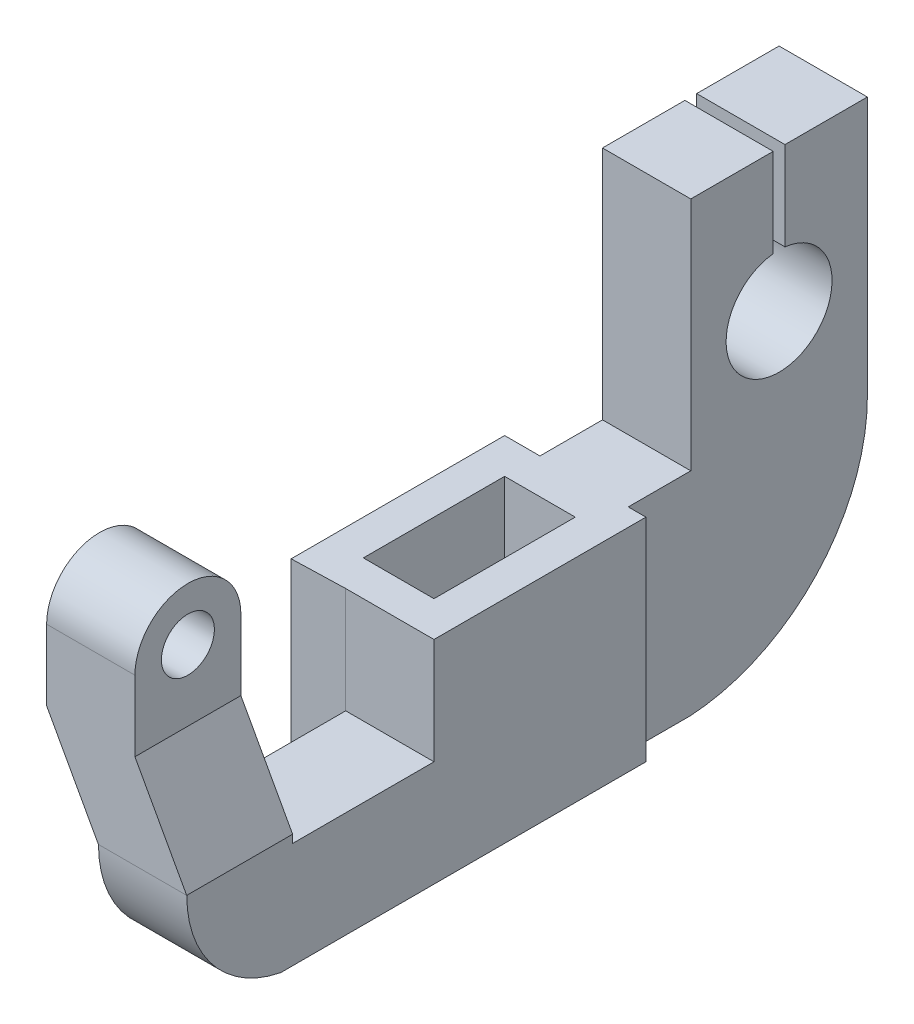
ISO-10303-21;
HEADER;
FILE_DESCRIPTION(('STEP AP214'),'2;1');
FILE_NAME('part.step','',(''),(''),'','','');
FILE_SCHEMA(('AUTOMOTIVE_DESIGN { 1 0 10303 214 1 1 1 1 }'));
ENDSEC;
DATA;
#1=APPLICATION_CONTEXT('core data for automotive mechanical design processes');
#2=APPLICATION_PROTOCOL_DEFINITION('international standard','automotive_design',2000,#1);
#3=PRODUCT_CONTEXT('',#1,'mechanical');
#4=PRODUCT('Part','Part','',(#3));
#5=PRODUCT_RELATED_PRODUCT_CATEGORY('part','',(#4));
#6=PRODUCT_DEFINITION_FORMATION('','',#4);
#7=PRODUCT_DEFINITION_CONTEXT('part definition',#1,'design');
#8=PRODUCT_DEFINITION('design','',#6,#7);
#9=PRODUCT_DEFINITION_SHAPE('','',#8);
#10=(LENGTH_UNIT() NAMED_UNIT(*) SI_UNIT(.MILLI.,.METRE.));
#11=(NAMED_UNIT(*) PLANE_ANGLE_UNIT() SI_UNIT($,.RADIAN.));
#12=(NAMED_UNIT(*) SI_UNIT($,.STERADIAN.) SOLID_ANGLE_UNIT());
#13=UNCERTAINTY_MEASURE_WITH_UNIT(LENGTH_MEASURE(1.E-05),#10,'distance_accuracy_value','');
#14=(GEOMETRIC_REPRESENTATION_CONTEXT(3) GLOBAL_UNCERTAINTY_ASSIGNED_CONTEXT((#13)) GLOBAL_UNIT_ASSIGNED_CONTEXT((#10,
#11,#12)) REPRESENTATION_CONTEXT('',''));
#15=CARTESIAN_POINT('',(0.,0.,0.));
#16=DIRECTION('',(0.,0.,1.));
#17=DIRECTION('',(1.,0.,0.));
#18=AXIS2_PLACEMENT_3D('',#15,#16,#17);
#19=CARTESIAN_POINT('',(-15.,0.,-36.2652508818495));
#20=DIRECTION('',(0.,0.,-1.));
#21=DIRECTION('',(-1.,0.,0.));
#22=AXIS2_PLACEMENT_3D('',#19,#20,#21);
#23=PLANE('',#22);
#24=DIRECTION('',(1.,0.,0.));
#25=VECTOR('',#24,1.);
#26=CARTESIAN_POINT('',(-15.,0.,-36.2652508818495));
#27=LINE('',#26,#25);
#28=CARTESIAN_POINT('',(-3.,0.,-36.2652508818495));
#29=VERTEX_POINT('',#28);
#30=CARTESIAN_POINT('',(0.,0.,-36.2652508818495));
#31=VERTEX_POINT('',#30);
#32=EDGE_CURVE('E490',#29,#31,#27,.T.);
#33=ORIENTED_EDGE('',*,*,#32,.F.);
#34=DIRECTION('',(0.,1.,0.));
#35=VECTOR('',#34,1.);
#36=CARTESIAN_POINT('',(-3.,0.,-36.2652508818495));
#37=LINE('',#36,#35);
#38=CARTESIAN_POINT('',(-3.,36.,-36.2652508818495));
#39=VERTEX_POINT('',#38);
#40=EDGE_CURVE('E358',#29,#39,#37,.T.);
#41=ORIENTED_EDGE('',*,*,#40,.T.);
#42=DIRECTION('',(1.,0.,0.));
#43=VECTOR('',#42,1.);
#44=CARTESIAN_POINT('',(-15.,36.,-36.2652508818495));
#45=LINE('',#44,#43);
#46=CARTESIAN_POINT('',(0.,36.,-36.2652508818495));
#47=VERTEX_POINT('',#46);
#48=EDGE_CURVE('E489',#39,#47,#45,.T.);
#49=ORIENTED_EDGE('',*,*,#48,.T.);
#50=DIRECTION('',(0.,1.,0.));
#51=VECTOR('',#50,1.);
#52=CARTESIAN_POINT('',(0.,0.,-36.2652508818495));
#53=LINE('',#52,#51);
#54=EDGE_CURVE('E464',#31,#47,#53,.T.);
#55=ORIENTED_EDGE('',*,*,#54,.F.);
#56=EDGE_LOOP('',(#33,#41,#49,#55));
#57=FACE_BOUND('',#56,.T.);
#58=ADVANCED_FACE('F43',(#57),#23,.T.);
#59=CARTESIAN_POINT('',(-15.,19.3567810669885,23.7347491181505));
#60=DIRECTION('',(0.,1.,0.));
#61=DIRECTION('',(0.,0.,1.));
#62=AXIS2_PLACEMENT_3D('',#59,#60,#61);
#63=PLANE('',#62);
#64=DIRECTION('',(0.,0.,1.));
#65=VECTOR('',#64,1.);
#66=CARTESIAN_POINT('',(-15.,19.3567810669885,23.7347491181505));
#67=LINE('',#66,#65);
#68=CARTESIAN_POINT('',(-15.,19.3567810669885,23.7347491181505));
#69=VERTEX_POINT('',#68);
#70=CARTESIAN_POINT('',(-15.,19.3567810669885,23.75));
#71=VERTEX_POINT('',#70);
#72=EDGE_CURVE('E456',#69,#71,#67,.T.);
#73=ORIENTED_EDGE('',*,*,#72,.T.);
#74=DIRECTION('',(1.,0.,0.));
#75=VECTOR('',#74,1.);
#76=CARTESIAN_POINT('',(-15.,19.3567810669885,23.75));
#77=LINE('',#76,#75);
#78=CARTESIAN_POINT('',(0.,19.3567810669885,23.75));
#79=VERTEX_POINT('',#78);
#80=EDGE_CURVE('E399',#71,#79,#77,.T.);
#81=ORIENTED_EDGE('',*,*,#80,.T.);
#82=DIRECTION('',(0.,0.,1.));
#83=VECTOR('',#82,1.);
#84=CARTESIAN_POINT('',(0.,19.3567810669885,23.7347491181505));
#85=LINE('',#84,#83);
#86=CARTESIAN_POINT('',(0.,19.3567810669885,23.7347491181505));
#87=VERTEX_POINT('',#86);
#88=EDGE_CURVE('E445',#87,#79,#85,.T.);
#89=ORIENTED_EDGE('',*,*,#88,.F.);
#90=DIRECTION('',(1.,0.,0.));
#91=VECTOR('',#90,1.);
#92=CARTESIAN_POINT('',(-15.,19.3567810669885,23.7347491181505));
#93=LINE('',#92,#91);
#94=EDGE_CURVE('E52',#69,#87,#93,.T.);
#95=ORIENTED_EDGE('',*,*,#94,.F.);
#96=EDGE_LOOP('',(#73,#81,#89,#95));
#97=FACE_BOUND('',#96,.T.);
#98=ADVANCED_FACE('F518',(#97),#63,.T.);
#99=CARTESIAN_POINT('',(-15.,19.3567810669885,22.0184091547458));
#100=DIRECTION('',(1.,0.,0.));
#101=DIRECTION('',(0.,0.,-1.));
#102=AXIS2_PLACEMENT_3D('',#99,#100,#101);
#103=CYLINDRICAL_SURFACE('',#102,19.7163399634047);
#104=CARTESIAN_POINT('',(0.,19.3567810669885,22.0184091547458));
#105=DIRECTION('',(1.,0.,0.));
#106=DIRECTION('',(0.,0.,-1.));
#107=AXIS2_PLACEMENT_3D('',#104,#105,#106);
#108=CIRCLE('',#107,19.7163399634047);
#109=CARTESIAN_POINT('',(0.,19.3567810669885,41.7347491181505));
#110=VERTEX_POINT('',#109);
#111=CARTESIAN_POINT('',(0.,0.,25.7666204984701));
#112=VERTEX_POINT('',#111);
#113=EDGE_CURVE('E440',#110,#112,#108,.T.);
#114=ORIENTED_EDGE('',*,*,#113,.F.);
#115=DIRECTION('',(1.,0.,0.));
#116=VECTOR('',#115,1.);
#117=CARTESIAN_POINT('',(-15.,19.3567810669885,41.7347491181505));
#118=LINE('',#117,#116);
#119=CARTESIAN_POINT('',(-15.,19.3567810669885,41.7347491181505));
#120=VERTEX_POINT('',#119);
#121=EDGE_CURVE('E11',#120,#110,#118,.T.);
#122=ORIENTED_EDGE('',*,*,#121,.F.);
#123=CARTESIAN_POINT('',(-15.,19.3567810669885,22.0184091547458));
#124=DIRECTION('',(1.,0.,0.));
#125=DIRECTION('',(0.,0.,-1.));
#126=AXIS2_PLACEMENT_3D('',#123,#124,#125);
#127=CIRCLE('',#126,19.7163399634047);
#128=CARTESIAN_POINT('',(-15.,0.,25.7666204984701));
#129=VERTEX_POINT('',#128);
#130=EDGE_CURVE('E441',#120,#129,#127,.T.);
#131=ORIENTED_EDGE('',*,*,#130,.T.);
#132=DIRECTION('',(1.,0.,0.));
#133=VECTOR('',#132,1.);
#134=CARTESIAN_POINT('',(-15.,0.,25.7666204984701));
#135=LINE('',#134,#133);
#136=EDGE_CURVE('E47',#129,#112,#135,.T.);
#137=ORIENTED_EDGE('',*,*,#136,.T.);
#138=EDGE_LOOP('',(#114,#122,#131,#137));
#139=FACE_BOUND('',#138,.T.);
#140=ADVANCED_FACE('F45',(#139),#103,.T.);
#141=CARTESIAN_POINT('',(-15.,18.,23.7347491181505));
#142=DIRECTION('',(0.,0.,-1.));
#143=DIRECTION('',(-1.,0.,0.));
#144=AXIS2_PLACEMENT_3D('',#141,#142,#143);
#145=PLANE('',#144);
#146=DIRECTION('',(0.,1.,0.));
#147=VECTOR('',#146,1.);
#148=CARTESIAN_POINT('',(0.,18.,23.7347491181505));
#149=LINE('',#148,#147);
#150=CARTESIAN_POINT('',(0.,18.,23.7347491181505));
#151=VERTEX_POINT('',#150);
#152=EDGE_CURVE('E476',#151,#87,#149,.T.);
#153=ORIENTED_EDGE('',*,*,#152,.F.);
#154=DIRECTION('',(1.,0.,0.));
#155=VECTOR('',#154,1.);
#156=CARTESIAN_POINT('',(-15.,18.,23.7347491181505));
#157=LINE('',#156,#155);
#158=CARTESIAN_POINT('',(-15.,18.,23.7347491181505));
#159=VERTEX_POINT('',#158);
#160=EDGE_CURVE('E483',#159,#151,#157,.T.);
#161=ORIENTED_EDGE('',*,*,#160,.F.);
#162=DIRECTION('',(0.,1.,0.));
#163=VECTOR('',#162,1.);
#164=CARTESIAN_POINT('',(-15.,18.,23.7347491181505));
#165=LINE('',#164,#163);
#166=EDGE_CURVE('E453',#159,#69,#165,.T.);
#167=ORIENTED_EDGE('',*,*,#166,.T.);
#168=ORIENTED_EDGE('',*,*,#94,.T.);
#169=EDGE_LOOP('',(#153,#161,#167,#168));
#170=FACE_BOUND('',#169,.T.);
#171=ADVANCED_FACE('F930',(#170),#145,.T.);
#172=CARTESIAN_POINT('',(-15.,18.,-0.265250881849475));
#173=DIRECTION('',(0.,1.,0.));
#174=DIRECTION('',(0.,0.,1.));
#175=AXIS2_PLACEMENT_3D('',#172,#173,#174);
#176=PLANE('',#175);
#177=DIRECTION('',(0.,0.,1.));
#178=VECTOR('',#177,1.);
#179=CARTESIAN_POINT('',(0.,18.,-0.265250881849475));
#180=LINE('',#179,#178);
#181=CARTESIAN_POINT('',(0.,18.,-0.265250881849475));
#182=VERTEX_POINT('',#181);
#183=EDGE_CURVE('E473',#182,#151,#180,.T.);
#184=ORIENTED_EDGE('',*,*,#183,.F.);
#185=DIRECTION('',(1.,0.,0.));
#186=VECTOR('',#185,1.);
#187=CARTESIAN_POINT('',(-15.,18.,-0.265250881849475));
#188=LINE('',#187,#186);
#189=CARTESIAN_POINT('',(-15.,18.,-0.265250881849475));
#190=VERTEX_POINT('',#189);
#191=EDGE_CURVE('E485',#190,#182,#188,.T.);
#192=ORIENTED_EDGE('',*,*,#191,.F.);
#193=DIRECTION('',(0.,0.,1.));
#194=VECTOR('',#193,1.);
#195=CARTESIAN_POINT('',(-15.,18.,-0.265250881849475));
#196=LINE('',#195,#194);
#197=EDGE_CURVE('E450',#190,#159,#196,.T.);
#198=ORIENTED_EDGE('',*,*,#197,.T.);
#199=ORIENTED_EDGE('',*,*,#160,.T.);
#200=EDGE_LOOP('',(#184,#192,#198,#199));
#201=FACE_BOUND('',#200,.T.);
#202=ADVANCED_FACE('F943',(#201),#176,.T.);
#203=CARTESIAN_POINT('',(-15.,36.,-0.26525088184947));
#204=DIRECTION('',(0.,0.,1.));
#205=DIRECTION('',(0.,-1.,0.));
#206=AXIS2_PLACEMENT_3D('',#203,#204,#205);
#207=PLANE('',#206);
#208=DIRECTION('',(0.,-1.,0.));
#209=VECTOR('',#208,1.);
#210=CARTESIAN_POINT('',(0.,36.,-0.26525088184947));
#211=LINE('',#210,#209);
#212=CARTESIAN_POINT('',(0.,36.,-0.26525088184947));
#213=VERTEX_POINT('',#212);
#214=EDGE_CURVE('E470',#213,#182,#211,.T.);
#215=ORIENTED_EDGE('',*,*,#214,.F.);
#216=DIRECTION('',(1.,0.,0.));
#217=VECTOR('',#216,1.);
#218=CARTESIAN_POINT('',(-15.,36.,-0.26525088184947));
#219=LINE('',#218,#217);
#220=CARTESIAN_POINT('',(-15.,36.,-0.26525088184947));
#221=VERTEX_POINT('',#220);
#222=EDGE_CURVE('E487',#221,#213,#219,.T.);
#223=ORIENTED_EDGE('',*,*,#222,.F.);
#224=DIRECTION('',(0.,-1.,0.));
#225=VECTOR('',#224,1.);
#226=CARTESIAN_POINT('',(-15.,36.,-0.26525088184947));
#227=LINE('',#226,#225);
#228=EDGE_CURVE('E447',#221,#190,#227,.T.);
#229=ORIENTED_EDGE('',*,*,#228,.T.);
#230=ORIENTED_EDGE('',*,*,#191,.T.);
#231=EDGE_LOOP('',(#215,#223,#229,#230));
#232=FACE_BOUND('',#231,.T.);
#233=ADVANCED_FACE('F568',(#232),#207,.T.);
#234=CARTESIAN_POINT('',(-15.,36.,-36.2652508818495));
#235=DIRECTION('',(0.,1.,0.));
#236=DIRECTION('',(0.,0.,1.));
#237=AXIS2_PLACEMENT_3D('',#234,#235,#236);
#238=PLANE('',#237);
#239=DIRECTION('',(0.,0.,1.));
#240=VECTOR('',#239,1.);
#241=CARTESIAN_POINT('',(-18.,36.,-30.2652508818495));
#242=LINE('',#241,#240);
#243=CARTESIAN_POINT('',(-18.,36.,-30.2652508818495));
#244=VERTEX_POINT('',#243);
#245=CARTESIAN_POINT('',(-18.,36.,-6.26525088184947));
#246=VERTEX_POINT('',#245);
#247=EDGE_CURVE('E302',#244,#246,#242,.T.);
#248=ORIENTED_EDGE('',*,*,#247,.F.);
#249=DIRECTION('',(-1.,0.,0.));
#250=VECTOR('',#249,1.);
#251=CARTESIAN_POINT('',(-18.,36.,-30.2652508818495));
#252=LINE('',#251,#250);
#253=CARTESIAN_POINT('',(-6.,36.,-30.2652508818495));
#254=VERTEX_POINT('',#253);
#255=EDGE_CURVE('E374',#254,#244,#252,.T.);
#256=ORIENTED_EDGE('',*,*,#255,.F.);
#257=DIRECTION('',(0.,0.,-1.));
#258=VECTOR('',#257,1.);
#259=CARTESIAN_POINT('',(-6.,36.,-30.2652508818495));
#260=LINE('',#259,#258);
#261=CARTESIAN_POINT('',(-6.,36.,-6.26525088184947));
#262=VERTEX_POINT('',#261);
#263=EDGE_CURVE('E381',#262,#254,#260,.T.);
#264=ORIENTED_EDGE('',*,*,#263,.F.);
#265=DIRECTION('',(1.,0.,0.));
#266=VECTOR('',#265,1.);
#267=CARTESIAN_POINT('',(-18.,36.,-6.26525088184947));
#268=LINE('',#267,#266);
#269=EDGE_CURVE('E368',#246,#262,#268,.T.);
#270=ORIENTED_EDGE('',*,*,#269,.F.);
#271=EDGE_LOOP('',(#248,#256,#264,#270));
#272=FACE_BOUND('',#271,.T.);
#273=DIRECTION('',(0.999565973902444,0.,-0.0294595284493729));
#274=VECTOR('',#273,1.);
#275=CARTESIAN_POINT('',(-24.,36.,0.));
#276=LINE('',#275,#274);
#277=CARTESIAN_POINT('',(-24.,36.,0.));
#278=VERTEX_POINT('',#277);
#279=EDGE_CURVE('E330',#278,#221,#276,.T.);
#280=ORIENTED_EDGE('',*,*,#279,.T.);
#281=ORIENTED_EDGE('',*,*,#222,.T.);
#282=DIRECTION('',(0.,0.,1.));
#283=VECTOR('',#282,1.);
#284=CARTESIAN_POINT('',(0.,36.,-36.2652508818495));
#285=LINE('',#284,#283);
#286=EDGE_CURVE('E467',#47,#213,#285,.T.);
#287=ORIENTED_EDGE('',*,*,#286,.F.);
#288=ORIENTED_EDGE('',*,*,#48,.F.);
#289=DIRECTION('',(0.,0.,-1.));
#290=VECTOR('',#289,1.);
#291=CARTESIAN_POINT('',(-3.,36.,-46.8885797178994));
#292=LINE('',#291,#290);
#293=CARTESIAN_POINT('',(-3.,36.,-46.8885797178994));
#294=VERTEX_POINT('',#293);
#295=EDGE_CURVE('E68',#39,#294,#292,.T.);
#296=ORIENTED_EDGE('',*,*,#295,.T.);
#297=DIRECTION('',(-1.,0.,0.));
#298=VECTOR('',#297,1.);
#299=CARTESIAN_POINT('',(-18.,36.,-46.8885797178994));
#300=LINE('',#299,#298);
#301=CARTESIAN_POINT('',(-18.,36.,-46.8885797178994));
#302=VERTEX_POINT('',#301);
#303=EDGE_CURVE('E360',#294,#302,#300,.T.);
#304=ORIENTED_EDGE('',*,*,#303,.T.);
#305=DIRECTION('',(0.,0.,1.));
#306=VECTOR('',#305,1.);
#307=CARTESIAN_POINT('',(-18.,36.,-36.2652508818495));
#308=LINE('',#307,#306);
#309=CARTESIAN_POINT('',(-18.,36.,-36.2652508818495));
#310=VERTEX_POINT('',#309);
#311=EDGE_CURVE('E352',#302,#310,#308,.T.);
#312=ORIENTED_EDGE('',*,*,#311,.T.);
#313=DIRECTION('',(-1.,0.,0.));
#314=VECTOR('',#313,1.);
#315=CARTESIAN_POINT('',(-15.,36.,-36.2652508818495));
#316=LINE('',#315,#314);
#317=CARTESIAN_POINT('',(-24.,36.,-36.2652508818495));
#318=VERTEX_POINT('',#317);
#319=EDGE_CURVE('E324',#310,#318,#316,.T.);
#320=ORIENTED_EDGE('',*,*,#319,.T.);
#321=DIRECTION('',(0.,0.,1.));
#322=VECTOR('',#321,1.);
#323=CARTESIAN_POINT('',(-24.,36.,-36.2652508818495));
#324=LINE('',#323,#322);
#325=EDGE_CURVE('E338',#318,#278,#324,.T.);
#326=ORIENTED_EDGE('',*,*,#325,.T.);
#327=EDGE_LOOP('',(#280,#281,#287,#288,#296,#304,#312,#320,#326));
#328=FACE_BOUND('',#327,.T.);
#329=ADVANCED_FACE('F559',(#272,#328),#238,.T.);
#330=CARTESIAN_POINT('',(-15.,0.,25.7666204984701));
#331=DIRECTION('',(0.,-1.,0.));
#332=DIRECTION('',(0.,0.,-1.));
#333=AXIS2_PLACEMENT_3D('',#330,#331,#332);
#334=PLANE('',#333);
#335=DIRECTION('',(0.,0.,1.));
#336=VECTOR('',#335,1.);
#337=CARTESIAN_POINT('',(-18.,0.,-30.2652508818495));
#338=LINE('',#337,#336);
#339=CARTESIAN_POINT('',(-18.,0.,-30.2652508818495));
#340=VERTEX_POINT('',#339);
#341=CARTESIAN_POINT('',(-18.,0.,-6.26525088184948));
#342=VERTEX_POINT('',#341);
#343=EDGE_CURVE('E315',#340,#342,#338,.T.);
#344=ORIENTED_EDGE('',*,*,#343,.T.);
#345=DIRECTION('',(1.,0.,0.));
#346=VECTOR('',#345,1.);
#347=CARTESIAN_POINT('',(-18.,0.,-6.26525088184948));
#348=LINE('',#347,#346);
#349=CARTESIAN_POINT('',(-6.,0.,-6.26525088184948));
#350=VERTEX_POINT('',#349);
#351=EDGE_CURVE('E370',#342,#350,#348,.T.);
#352=ORIENTED_EDGE('',*,*,#351,.T.);
#353=DIRECTION('',(0.,0.,-1.));
#354=VECTOR('',#353,1.);
#355=CARTESIAN_POINT('',(-6.,0.,-30.2652508818495));
#356=LINE('',#355,#354);
#357=CARTESIAN_POINT('',(-6.,0.,-30.2652508818495));
#358=VERTEX_POINT('',#357);
#359=EDGE_CURVE('E373',#350,#358,#356,.T.);
#360=ORIENTED_EDGE('',*,*,#359,.T.);
#361=DIRECTION('',(-1.,0.,0.));
#362=VECTOR('',#361,1.);
#363=CARTESIAN_POINT('',(-18.,0.,-30.2652508818495));
#364=LINE('',#363,#362);
#365=EDGE_CURVE('E377',#358,#340,#364,.T.);
#366=ORIENTED_EDGE('',*,*,#365,.T.);
#367=EDGE_LOOP('',(#344,#352,#360,#366));
#368=FACE_BOUND('',#367,.T.);
#369=DIRECTION('',(0.,0.,-1.));
#370=VECTOR('',#369,1.);
#371=CARTESIAN_POINT('',(-15.,0.,25.7666204984701));
#372=LINE('',#371,#370);
#373=CARTESIAN_POINT('',(-15.,0.,-0.26525088184947));
#374=VERTEX_POINT('',#373);
#375=EDGE_CURVE('E444',#129,#374,#372,.T.);
#376=ORIENTED_EDGE('',*,*,#375,.T.);
#377=DIRECTION('',(0.999565973902444,0.,-0.0294595284493729));
#378=VECTOR('',#377,1.);
#379=CARTESIAN_POINT('',(-24.,0.,0.));
#380=LINE('',#379,#378);
#381=CARTESIAN_POINT('',(-24.,0.,0.));
#382=VERTEX_POINT('',#381);
#383=EDGE_CURVE('E333',#382,#374,#380,.T.);
#384=ORIENTED_EDGE('',*,*,#383,.F.);
#385=DIRECTION('',(0.,0.,1.));
#386=VECTOR('',#385,1.);
#387=CARTESIAN_POINT('',(-24.,0.,-36.2652508818495));
#388=LINE('',#387,#386);
#389=CARTESIAN_POINT('',(-24.,0.,-36.2652508818495));
#390=VERTEX_POINT('',#389);
#391=EDGE_CURVE('E329',#390,#382,#388,.T.);
#392=ORIENTED_EDGE('',*,*,#391,.F.);
#393=DIRECTION('',(-1.,0.,0.));
#394=VECTOR('',#393,1.);
#395=CARTESIAN_POINT('',(-15.,0.,-36.2652508818495));
#396=LINE('',#395,#394);
#397=CARTESIAN_POINT('',(-18.,0.,-36.2652508818495));
#398=VERTEX_POINT('',#397);
#399=EDGE_CURVE('E327',#398,#390,#396,.T.);
#400=ORIENTED_EDGE('',*,*,#399,.F.);
#401=DIRECTION('',(0.,0.,1.));
#402=VECTOR('',#401,1.);
#403=CARTESIAN_POINT('',(-18.,0.,-36.2652508818495));
#404=LINE('',#403,#402);
#405=CARTESIAN_POINT('',(-18.,0.,-46.8885797178995));
#406=VERTEX_POINT('',#405);
#407=EDGE_CURVE('E355',#406,#398,#404,.T.);
#408=ORIENTED_EDGE('',*,*,#407,.F.);
#409=DIRECTION('',(-1.,0.,0.));
#410=VECTOR('',#409,1.);
#411=CARTESIAN_POINT('',(-18.,0.,-46.8885797178995));
#412=LINE('',#411,#410);
#413=CARTESIAN_POINT('',(-3.,0.,-46.8885797178995));
#414=VERTEX_POINT('',#413);
#415=EDGE_CURVE('E351',#414,#406,#412,.T.);
#416=ORIENTED_EDGE('',*,*,#415,.F.);
#417=DIRECTION('',(0.,0.,-1.));
#418=VECTOR('',#417,1.);
#419=CARTESIAN_POINT('',(-3.,0.,-46.8885797178995));
#420=LINE('',#419,#418);
#421=EDGE_CURVE('E348',#29,#414,#420,.T.);
#422=ORIENTED_EDGE('',*,*,#421,.F.);
#423=ORIENTED_EDGE('',*,*,#32,.T.);
#424=DIRECTION('',(0.,0.,-1.));
#425=VECTOR('',#424,1.);
#426=CARTESIAN_POINT('',(0.,0.,25.7666204984701));
#427=LINE('',#426,#425);
#428=EDGE_CURVE('E461',#112,#31,#427,.T.);
#429=ORIENTED_EDGE('',*,*,#428,.F.);
#430=ORIENTED_EDGE('',*,*,#136,.F.);
#431=EDGE_LOOP('',(#376,#384,#392,#400,#408,#416,#422,#423,#429,#430));
#432=FACE_BOUND('',#431,.T.);
#433=ADVANCED_FACE('F500',(#368,#432),#334,.T.);
#434=CARTESIAN_POINT('',(-15.,19.3567810669885,22.0184091547458));
#435=DIRECTION('',(1.,0.,0.));
#436=DIRECTION('',(0.,0.,-1.));
#437=AXIS2_PLACEMENT_3D('',#434,#435,#436);
#438=PLANE('',#437);
#439=ORIENTED_EDGE('',*,*,#197,.F.);
#440=DIRECTION('',(0.,1.,0.));
#441=VECTOR('',#440,1.);
#442=CARTESIAN_POINT('',(-15.,0.,-0.265250881849478));
#443=LINE('',#442,#441);
#444=EDGE_CURVE('E60',#374,#190,#443,.T.);
#445=ORIENTED_EDGE('',*,*,#444,.F.);
#446=ORIENTED_EDGE('',*,*,#375,.F.);
#447=ORIENTED_EDGE('',*,*,#130,.F.);
#448=DIRECTION('',(0.,0.,-1.));
#449=VECTOR('',#448,1.);
#450=CARTESIAN_POINT('',(-15.,19.3567810669885,41.75));
#451=LINE('',#450,#449);
#452=EDGE_CURVE('E416',#120,#71,#451,.T.);
#453=ORIENTED_EDGE('',*,*,#452,.T.);
#454=ORIENTED_EDGE('',*,*,#72,.F.);
#455=ORIENTED_EDGE('',*,*,#166,.F.);
#456=EDGE_LOOP('',(#439,#445,#446,#447,#453,#454,#455));
#457=FACE_BOUND('',#456,.T.);
#458=ADVANCED_FACE('F521',(#457),#438,.F.);
#459=CARTESIAN_POINT('',(0.,19.3567810669885,22.0184091547458));
#460=DIRECTION('',(1.,0.,0.));
#461=DIRECTION('',(0.,0.,-1.));
#462=AXIS2_PLACEMENT_3D('',#459,#460,#461);
#463=PLANE('',#462);
#464=ORIENTED_EDGE('',*,*,#113,.T.);
#465=ORIENTED_EDGE('',*,*,#428,.T.);
#466=ORIENTED_EDGE('',*,*,#54,.T.);
#467=ORIENTED_EDGE('',*,*,#286,.T.);
#468=ORIENTED_EDGE('',*,*,#214,.T.);
#469=ORIENTED_EDGE('',*,*,#183,.T.);
#470=ORIENTED_EDGE('',*,*,#152,.T.);
#471=ORIENTED_EDGE('',*,*,#88,.T.);
#472=EDGE_CURVE('E479',#79,#110,#85,.T.);
#473=ORIENTED_EDGE('',*,*,#472,.T.);
#474=EDGE_LOOP('',(#464,#465,#466,#467,#468,#469,#470,#471,#473));
#475=FACE_BOUND('',#474,.T.);
#476=ADVANCED_FACE('F503',(#475),#463,.T.);
#477=CARTESIAN_POINT('',(-15.,19.3567810669885,41.75));
#478=DIRECTION('',(0.,1.,0.));
#479=DIRECTION('',(0.,0.,1.));
#480=AXIS2_PLACEMENT_3D('',#477,#478,#479);
#481=PLANE('',#480);
#482=ORIENTED_EDGE('',*,*,#121,.T.);
#483=DIRECTION('',(0.,0.,-1.));
#484=VECTOR('',#483,1.);
#485=CARTESIAN_POINT('',(0.,19.3567810669885,41.75));
#486=LINE('',#485,#484);
#487=CARTESIAN_POINT('',(0.,19.3567810669885,41.75));
#488=VERTEX_POINT('',#487);
#489=EDGE_CURVE('E438',#488,#110,#486,.T.);
#490=ORIENTED_EDGE('',*,*,#489,.F.);
#491=DIRECTION('',(1.,0.,0.));
#492=VECTOR('',#491,1.);
#493=CARTESIAN_POINT('',(-15.,19.3567810669885,41.75));
#494=LINE('',#493,#492);
#495=CARTESIAN_POINT('',(-15.,19.3567810669885,41.75));
#496=VERTEX_POINT('',#495);
#497=EDGE_CURVE('E402',#496,#488,#494,.T.);
#498=ORIENTED_EDGE('',*,*,#497,.F.);
#499=EDGE_CURVE('E429',#496,#120,#451,.T.);
#500=ORIENTED_EDGE('',*,*,#499,.T.);
#501=EDGE_LOOP('',(#482,#490,#498,#500));
#502=FACE_BOUND('',#501,.T.);
#503=ADVANCED_FACE('F528',(#502),#481,.F.);
#504=CARTESIAN_POINT('',(0.,19.3567810669885,41.75));
#505=DIRECTION('',(-0.876416076820831,-0.481554628562517,0.));
#506=DIRECTION('',(0.481554628562517,-0.876416076820831,0.));
#507=AXIS2_PLACEMENT_3D('',#504,#505,#506);
#508=PLANE('',#507);
#509=DIRECTION('',(-0.481554628562518,0.876416076820831,0.));
#510=VECTOR('',#509,1.);
#511=CARTESIAN_POINT('',(0.,19.3567810669885,23.75));
#512=LINE('',#511,#510);
#513=CARTESIAN_POINT('',(-8.79134267475951,35.3567810669886,23.75));
#514=VERTEX_POINT('',#513);
#515=EDGE_CURVE('E419',#79,#514,#512,.T.);
#516=ORIENTED_EDGE('',*,*,#515,.T.);
#517=DIRECTION('',(0.,0.,-1.));
#518=VECTOR('',#517,1.);
#519=CARTESIAN_POINT('',(-8.79134267475951,35.3567810669886,41.75));
#520=LINE('',#519,#518);
#521=CARTESIAN_POINT('',(-8.79134267475951,35.3567810669886,41.75));
#522=VERTEX_POINT('',#521);
#523=EDGE_CURVE('E435',#522,#514,#520,.T.);
#524=ORIENTED_EDGE('',*,*,#523,.F.);
#525=DIRECTION('',(-0.481554628562518,0.876416076820831,0.));
#526=VECTOR('',#525,1.);
#527=CARTESIAN_POINT('',(0.,19.3567810669885,41.75));
#528=LINE('',#527,#526);
#529=EDGE_CURVE('E405',#488,#522,#528,.T.);
#530=ORIENTED_EDGE('',*,*,#529,.F.);
#531=ORIENTED_EDGE('',*,*,#489,.T.);
#532=ORIENTED_EDGE('',*,*,#472,.F.);
#533=EDGE_LOOP('',(#516,#524,#530,#531,#532));
#534=FACE_BOUND('',#533,.T.);
#535=ADVANCED_FACE('F507',(#534),#508,.F.);
#536=CARTESIAN_POINT('',(-8.79134267475951,35.3567810669886,41.75));
#537=DIRECTION('',(-1.,0.,0.));
#538=DIRECTION('',(0.,0.,1.));
#539=AXIS2_PLACEMENT_3D('',#536,#537,#538);
#540=PLANE('',#539);
#541=CARTESIAN_POINT('',(-8.79134267475951,47.3567810669885,32.75));
#542=DIRECTION('',(1.,0.,0.));
#543=DIRECTION('',(0.,0.,-1.));
#544=AXIS2_PLACEMENT_3D('',#541,#542,#543);
#545=CIRCLE('',#544,4.5);
#546=CARTESIAN_POINT('',(-8.79134267475951,47.3567810669885,28.25));
#547=VERTEX_POINT('',#546);
#548=EDGE_CURVE('E387',#547,#547,#545,.T.);
#549=ORIENTED_EDGE('',*,*,#548,.F.);
#550=EDGE_LOOP('',(#549));
#551=FACE_BOUND('',#550,.T.);
#552=DIRECTION('',(0.,1.,0.));
#553=VECTOR('',#552,1.);
#554=CARTESIAN_POINT('',(-8.79134267475951,35.3567810669886,23.75));
#555=LINE('',#554,#553);
#556=CARTESIAN_POINT('',(-8.79134267475951,47.3567810669886,23.75));
#557=VERTEX_POINT('',#556);
#558=EDGE_CURVE('E421',#514,#557,#555,.T.);
#559=ORIENTED_EDGE('',*,*,#558,.T.);
#560=CARTESIAN_POINT('',(-8.79134267475951,47.3567810669885,32.75));
#561=DIRECTION('',(1.,0.,0.));
#562=DIRECTION('',(0.,0.,1.));
#563=AXIS2_PLACEMENT_3D('',#560,#561,#562);
#564=CIRCLE('',#563,9.);
#565=CARTESIAN_POINT('',(-8.79134267475951,47.3567810669886,41.75));
#566=VERTEX_POINT('',#565);
#567=EDGE_CURVE('E393',#557,#566,#564,.T.);
#568=ORIENTED_EDGE('',*,*,#567,.T.);
#569=DIRECTION('',(0.,1.,0.));
#570=VECTOR('',#569,1.);
#571=CARTESIAN_POINT('',(-8.79134267475951,35.3567810669886,41.75));
#572=LINE('',#571,#570);
#573=EDGE_CURVE('E408',#522,#566,#572,.T.);
#574=ORIENTED_EDGE('',*,*,#573,.F.);
#575=ORIENTED_EDGE('',*,*,#523,.T.);
#576=EDGE_LOOP('',(#559,#568,#574,#575));
#577=FACE_BOUND('',#576,.T.);
#578=ADVANCED_FACE('F541',(#551,#577),#540,.F.);
#579=CARTESIAN_POINT('',(-23.7913426747595,35.3567810669886,41.75));
#580=DIRECTION('',(1.,0.,0.));
#581=DIRECTION('',(0.,0.,-1.));
#582=AXIS2_PLACEMENT_3D('',#579,#580,#581);
#583=PLANE('',#582);
#584=CARTESIAN_POINT('',(-23.7913426747595,47.3567810669885,32.75));
#585=DIRECTION('',(1.,0.,0.));
#586=DIRECTION('',(0.,0.,-1.));
#587=AXIS2_PLACEMENT_3D('',#584,#585,#586);
#588=CIRCLE('',#587,4.5);
#589=CARTESIAN_POINT('',(-23.7913426747595,47.3567810669885,28.25));
#590=VERTEX_POINT('',#589);
#591=EDGE_CURVE('E390',#590,#590,#588,.T.);
#592=ORIENTED_EDGE('',*,*,#591,.T.);
#593=EDGE_LOOP('',(#592));
#594=FACE_BOUND('',#593,.T.);
#595=DIRECTION('',(0.,-1.,0.));
#596=VECTOR('',#595,1.);
#597=CARTESIAN_POINT('',(-23.7913426747595,35.3567810669886,23.75));
#598=LINE('',#597,#596);
#599=CARTESIAN_POINT('',(-23.7913426747595,47.3567810669885,23.75));
#600=VERTEX_POINT('',#599);
#601=CARTESIAN_POINT('',(-23.7913426747595,35.3567810669886,23.75));
#602=VERTEX_POINT('',#601);
#603=EDGE_CURVE('E426',#600,#602,#598,.T.);
#604=ORIENTED_EDGE('',*,*,#603,.T.);
#605=DIRECTION('',(0.,0.,-1.));
#606=VECTOR('',#605,1.);
#607=CARTESIAN_POINT('',(-23.7913426747595,35.3567810669886,41.75));
#608=LINE('',#607,#606);
#609=CARTESIAN_POINT('',(-23.7913426747595,35.3567810669886,41.75));
#610=VERTEX_POINT('',#609);
#611=EDGE_CURVE('E432',#610,#602,#608,.T.);
#612=ORIENTED_EDGE('',*,*,#611,.F.);
#613=DIRECTION('',(0.,-1.,0.));
#614=VECTOR('',#613,1.);
#615=CARTESIAN_POINT('',(-23.7913426747595,35.3567810669886,41.75));
#616=LINE('',#615,#614);
#617=CARTESIAN_POINT('',(-23.7913426747595,47.3567810669886,41.75));
#618=VERTEX_POINT('',#617);
#619=EDGE_CURVE('E412',#618,#610,#616,.T.);
#620=ORIENTED_EDGE('',*,*,#619,.F.);
#621=CARTESIAN_POINT('',(-23.7913426747595,47.3567810669885,32.75));
#622=DIRECTION('',(1.,0.,0.));
#623=DIRECTION('',(0.,0.,1.));
#624=AXIS2_PLACEMENT_3D('',#621,#622,#623);
#625=CIRCLE('',#624,9.);
#626=EDGE_CURVE('E396',#600,#618,#625,.T.);
#627=ORIENTED_EDGE('',*,*,#626,.F.);
#628=EDGE_LOOP('',(#604,#612,#620,#627));
#629=FACE_BOUND('',#628,.T.);
#630=ADVANCED_FACE('F539',(#594,#629),#583,.F.);
#631=CARTESIAN_POINT('',(-15.,19.3567810669885,41.75));
#632=DIRECTION('',(0.876416076820831,0.481554628562517,0.));
#633=DIRECTION('',(-0.481554628562517,0.876416076820831,0.));
#634=AXIS2_PLACEMENT_3D('',#631,#632,#633);
#635=PLANE('',#634);
#636=DIRECTION('',(0.481554628562518,-0.876416076820831,0.));
#637=VECTOR('',#636,1.);
#638=CARTESIAN_POINT('',(-15.,19.3567810669885,23.75));
#639=LINE('',#638,#637);
#640=EDGE_CURVE('E406',#602,#71,#639,.T.);
#641=ORIENTED_EDGE('',*,*,#640,.T.);
#642=ORIENTED_EDGE('',*,*,#452,.F.);
#643=ORIENTED_EDGE('',*,*,#499,.F.);
#644=DIRECTION('',(0.481554628562518,-0.876416076820831,0.));
#645=VECTOR('',#644,1.);
#646=CARTESIAN_POINT('',(-15.,19.3567810669885,41.75));
#647=LINE('',#646,#645);
#648=EDGE_CURVE('E414',#610,#496,#647,.T.);
#649=ORIENTED_EDGE('',*,*,#648,.F.);
#650=ORIENTED_EDGE('',*,*,#611,.T.);
#651=EDGE_LOOP('',(#641,#642,#643,#649,#650));
#652=FACE_BOUND('',#651,.T.);
#653=ADVANCED_FACE('F524',(#652),#635,.F.);
#654=CARTESIAN_POINT('',(0.,0.,41.75));
#655=DIRECTION('',(0.,0.,1.));
#656=DIRECTION('',(1.,0.,0.));
#657=AXIS2_PLACEMENT_3D('',#654,#655,#656);
#658=PLANE('',#657);
#659=ORIENTED_EDGE('',*,*,#497,.T.);
#660=ORIENTED_EDGE('',*,*,#529,.T.);
#661=ORIENTED_EDGE('',*,*,#573,.T.);
#662=DIRECTION('',(-1.,0.,0.));
#663=VECTOR('',#662,1.);
#664=CARTESIAN_POINT('',(-23.7913426747595,47.3567810669886,41.75));
#665=LINE('',#664,#663);
#666=EDGE_CURVE('E410',#566,#618,#665,.T.);
#667=ORIENTED_EDGE('',*,*,#666,.T.);
#668=ORIENTED_EDGE('',*,*,#619,.T.);
#669=ORIENTED_EDGE('',*,*,#648,.T.);
#670=EDGE_LOOP('',(#659,#660,#661,#667,#668,#669));
#671=FACE_BOUND('',#670,.T.);
#672=ADVANCED_FACE('F530',(#671),#658,.T.);
#673=CARTESIAN_POINT('',(0.,0.,23.75));
#674=DIRECTION('',(0.,0.,1.));
#675=DIRECTION('',(1.,0.,0.));
#676=AXIS2_PLACEMENT_3D('',#673,#674,#675);
#677=PLANE('',#676);
#678=ORIENTED_EDGE('',*,*,#80,.F.);
#679=ORIENTED_EDGE('',*,*,#640,.F.);
#680=ORIENTED_EDGE('',*,*,#603,.F.);
#681=DIRECTION('',(-1.,0.,0.));
#682=VECTOR('',#681,1.);
#683=CARTESIAN_POINT('',(-23.7913426747595,47.3567810669886,23.75));
#684=LINE('',#683,#682);
#685=EDGE_CURVE('E423',#557,#600,#684,.T.);
#686=ORIENTED_EDGE('',*,*,#685,.F.);
#687=ORIENTED_EDGE('',*,*,#558,.F.);
#688=ORIENTED_EDGE('',*,*,#515,.F.);
#689=EDGE_LOOP('',(#678,#679,#680,#686,#687,#688));
#690=FACE_BOUND('',#689,.T.);
#691=ADVANCED_FACE('F513',(#690),#677,.F.);
#692=CARTESIAN_POINT('',(-23.7913426747595,47.3567810669885,32.75));
#693=DIRECTION('',(1.,0.,0.));
#694=DIRECTION('',(0.,0.,-1.));
#695=AXIS2_PLACEMENT_3D('',#692,#693,#694);
#696=CYLINDRICAL_SURFACE('',#695,9.);
#697=ORIENTED_EDGE('',*,*,#567,.F.);
#698=ORIENTED_EDGE('',*,*,#685,.T.);
#699=ORIENTED_EDGE('',*,*,#626,.T.);
#700=ORIENTED_EDGE('',*,*,#666,.F.);
#701=EDGE_LOOP('',(#697,#698,#699,#700));
#702=FACE_BOUND('',#701,.T.);
#703=ADVANCED_FACE('F537',(#702),#696,.T.);
#704=CARTESIAN_POINT('',(-23.7913426747595,47.3567810669885,32.75));
#705=DIRECTION('',(1.,0.,0.));
#706=DIRECTION('',(0.,0.,-1.));
#707=AXIS2_PLACEMENT_3D('',#704,#705,#706);
#708=CYLINDRICAL_SURFACE('',#707,4.5);
#709=ORIENTED_EDGE('',*,*,#591,.F.);
#710=EDGE_LOOP('',(#709));
#711=FACE_BOUND('',#710,.T.);
#712=ORIENTED_EDGE('',*,*,#548,.T.);
#713=EDGE_LOOP('',(#712));
#714=FACE_BOUND('',#713,.T.);
#715=ADVANCED_FACE('F647',(#711,#714),#708,.F.);
#716=CARTESIAN_POINT('',(-18.,0.,-30.2652508818495));
#717=DIRECTION('',(0.,0.,-1.));
#718=DIRECTION('',(0.,1.,0.));
#719=AXIS2_PLACEMENT_3D('',#716,#717,#718);
#720=PLANE('',#719);
#721=ORIENTED_EDGE('',*,*,#365,.F.);
#722=DIRECTION('',(0.,1.,0.));
#723=VECTOR('',#722,1.);
#724=CARTESIAN_POINT('',(-6.,0.,-30.2652508818495));
#725=LINE('',#724,#723);
#726=EDGE_CURVE('E385',#358,#254,#725,.T.);
#727=ORIENTED_EDGE('',*,*,#726,.T.);
#728=ORIENTED_EDGE('',*,*,#255,.T.);
#729=DIRECTION('',(0.,1.,0.));
#730=VECTOR('',#729,1.);
#731=CARTESIAN_POINT('',(-18.,0.,-30.2652508818495));
#732=LINE('',#731,#730);
#733=EDGE_CURVE('E321',#340,#244,#732,.T.);
#734=ORIENTED_EDGE('',*,*,#733,.F.);
#735=EDGE_LOOP('',(#721,#727,#728,#734));
#736=FACE_BOUND('',#735,.T.);
#737=ADVANCED_FACE('F585',(#736),#720,.F.);
#738=CARTESIAN_POINT('',(-18.,0.,-6.26525088184948));
#739=DIRECTION('',(0.,0.,1.));
#740=DIRECTION('',(0.,-1.,0.));
#741=AXIS2_PLACEMENT_3D('',#738,#739,#740);
#742=PLANE('',#741);
#743=ORIENTED_EDGE('',*,*,#269,.T.);
#744=DIRECTION('',(0.,1.,0.));
#745=VECTOR('',#744,1.);
#746=CARTESIAN_POINT('',(-6.,0.,-6.26525088184948));
#747=LINE('',#746,#745);
#748=EDGE_CURVE('E379',#350,#262,#747,.T.);
#749=ORIENTED_EDGE('',*,*,#748,.F.);
#750=ORIENTED_EDGE('',*,*,#351,.F.);
#751=DIRECTION('',(0.,1.,0.));
#752=VECTOR('',#751,1.);
#753=CARTESIAN_POINT('',(-18.,0.,-6.26525088184948));
#754=LINE('',#753,#752);
#755=EDGE_CURVE('E318',#342,#246,#754,.T.);
#756=ORIENTED_EDGE('',*,*,#755,.T.);
#757=EDGE_LOOP('',(#743,#749,#750,#756));
#758=FACE_BOUND('',#757,.T.);
#759=ADVANCED_FACE('F578',(#758),#742,.F.);
#760=CARTESIAN_POINT('',(-6.,0.,-30.2652508818495));
#761=DIRECTION('',(1.,0.,0.));
#762=DIRECTION('',(0.,0.,-1.));
#763=AXIS2_PLACEMENT_3D('',#760,#761,#762);
#764=PLANE('',#763);
#765=ORIENTED_EDGE('',*,*,#263,.T.);
#766=ORIENTED_EDGE('',*,*,#726,.F.);
#767=ORIENTED_EDGE('',*,*,#359,.F.);
#768=ORIENTED_EDGE('',*,*,#748,.T.);
#769=EDGE_LOOP('',(#765,#766,#767,#768));
#770=FACE_BOUND('',#769,.T.);
#771=ADVANCED_FACE('F582',(#770),#764,.F.);
#772=CARTESIAN_POINT('',(-18.,0.,-36.2652508818495));
#773=DIRECTION('',(-1.,0.,0.));
#774=DIRECTION('',(0.,0.,1.));
#775=AXIS2_PLACEMENT_3D('',#772,#773,#774);
#776=PLANE('',#775);
#777=ORIENTED_EDGE('',*,*,#311,.F.);
#778=DIRECTION('',(0.,1.,0.));
#779=VECTOR('',#778,1.);
#780=CARTESIAN_POINT('',(-18.,0.,-46.8885797178994));
#781=LINE('',#780,#779);
#782=CARTESIAN_POINT('',(-18.,76.,-46.8885797178994));
#783=VERTEX_POINT('',#782);
#784=EDGE_CURVE('E282',#302,#783,#781,.T.);
#785=ORIENTED_EDGE('',*,*,#784,.T.);
#786=DIRECTION('',(0.,0.,-1.));
#787=VECTOR('',#786,1.);
#788=CARTESIAN_POINT('',(-18.,76.,0.));
#789=LINE('',#788,#787);
#790=CARTESIAN_POINT('',(-18.,76.,-60.8885797178995));
#791=VERTEX_POINT('',#790);
#792=EDGE_CURVE('E256',#783,#791,#789,.T.);
#793=ORIENTED_EDGE('',*,*,#792,.T.);
#794=DIRECTION('',(0.,-1.,0.));
#795=VECTOR('',#794,1.);
#796=CARTESIAN_POINT('',(-18.,0.,-60.8885797178995));
#797=LINE('',#796,#795);
#798=CARTESIAN_POINT('',(-18.,60.9442719099992,-60.8885797178995));
#799=VERTEX_POINT('',#798);
#800=EDGE_CURVE('E247',#791,#799,#797,.T.);
#801=ORIENTED_EDGE('',*,*,#800,.T.);
#802=CARTESIAN_POINT('',(-18.,52.,-61.8885797178994));
#803=DIRECTION('',(1.,0.,0.));
#804=DIRECTION('',(0.,0.,-1.));
#805=AXIS2_PLACEMENT_3D('',#802,#803,#804);
#806=CIRCLE('',#805,9.);
#807=CARTESIAN_POINT('',(-18.,60.9442719099992,-62.8885797178994));
#808=VERTEX_POINT('',#807);
#809=EDGE_CURVE('E253',#799,#808,#806,.T.);
#810=ORIENTED_EDGE('',*,*,#809,.T.);
#811=DIRECTION('',(0.,-1.,0.));
#812=VECTOR('',#811,1.);
#813=CARTESIAN_POINT('',(-18.,0.,-62.8885797178994));
#814=LINE('',#813,#812);
#815=CARTESIAN_POINT('',(-18.,76.,-62.8885797178994));
#816=VERTEX_POINT('',#815);
#817=EDGE_CURVE('E270',#816,#808,#814,.T.);
#818=ORIENTED_EDGE('',*,*,#817,.F.);
#819=CARTESIAN_POINT('',(-18.,76.,-76.8885797178994));
#820=VERTEX_POINT('',#819);
#821=EDGE_CURVE('E283',#816,#820,#789,.T.);
#822=ORIENTED_EDGE('',*,*,#821,.T.);
#823=DIRECTION('',(0.,-1.,0.));
#824=VECTOR('',#823,1.);
#825=CARTESIAN_POINT('',(-18.,0.,-76.8885797178994));
#826=LINE('',#825,#824);
#827=CARTESIAN_POINT('',(-18.,31.9374388453426,-76.8885797178994));
#828=VERTEX_POINT('',#827);
#829=EDGE_CURVE('E287',#820,#828,#826,.T.);
#830=ORIENTED_EDGE('',*,*,#829,.T.);
#831=CARTESIAN_POINT('',(-18.,31.9374388453426,-44.8885797178994));
#832=DIRECTION('',(1.,0.,0.));
#833=DIRECTION('',(0.,0.,-1.));
#834=AXIS2_PLACEMENT_3D('',#831,#832,#833);
#835=CIRCLE('',#834,32.);
#836=EDGE_CURVE('E285',#828,#406,#835,.F.);
#837=ORIENTED_EDGE('',*,*,#836,.T.);
#838=ORIENTED_EDGE('',*,*,#407,.T.);
#839=DIRECTION('',(0.,1.,0.));
#840=VECTOR('',#839,1.);
#841=CARTESIAN_POINT('',(-18.,0.,-36.2652508818495));
#842=LINE('',#841,#840);
#843=EDGE_CURVE('E365',#398,#310,#842,.T.);
#844=ORIENTED_EDGE('',*,*,#843,.T.);
#845=EDGE_LOOP('',(#777,#785,#793,#801,#810,#818,#822,#830,#837,#838,#844));
#846=FACE_BOUND('',#845,.T.);
#847=ADVANCED_FACE('F250',(#846),#776,.T.);
#848=CARTESIAN_POINT('',(-3.,0.,-46.8885797178995));
#849=DIRECTION('',(1.,0.,0.));
#850=DIRECTION('',(0.,0.,-1.));
#851=AXIS2_PLACEMENT_3D('',#848,#849,#850);
#852=PLANE('',#851);
#853=ORIENTED_EDGE('',*,*,#295,.F.);
#854=ORIENTED_EDGE('',*,*,#40,.F.);
#855=ORIENTED_EDGE('',*,*,#421,.T.);
#856=CARTESIAN_POINT('',(-3.,31.9374388453426,-44.8885797178994));
#857=DIRECTION('',(1.,0.,0.));
#858=DIRECTION('',(0.,0.,-1.));
#859=AXIS2_PLACEMENT_3D('',#856,#857,#858);
#860=CIRCLE('',#859,32.);
#861=CARTESIAN_POINT('',(-3.00000000000001,31.9374388453426,-76.8885797178994));
#862=VERTEX_POINT('',#861);
#863=EDGE_CURVE('E297',#862,#414,#860,.F.);
#864=ORIENTED_EDGE('',*,*,#863,.F.);
#865=DIRECTION('',(0.,-1.,0.));
#866=VECTOR('',#865,1.);
#867=CARTESIAN_POINT('',(-3.00000000000001,0.,-76.8885797178994));
#868=LINE('',#867,#866);
#869=CARTESIAN_POINT('',(-3.00000000000001,76.,-76.8885797178994));
#870=VERTEX_POINT('',#869);
#871=EDGE_CURVE('E299',#870,#862,#868,.T.);
#872=ORIENTED_EDGE('',*,*,#871,.F.);
#873=DIRECTION('',(0.,0.,-1.));
#874=VECTOR('',#873,1.);
#875=CARTESIAN_POINT('',(-2.99999999999999,76.,0.));
#876=LINE('',#875,#874);
#877=CARTESIAN_POINT('',(-3.,76.,-62.8885797178994));
#878=VERTEX_POINT('',#877);
#879=EDGE_CURVE('E278',#878,#870,#876,.T.);
#880=ORIENTED_EDGE('',*,*,#879,.F.);
#881=DIRECTION('',(0.,-1.,0.));
#882=VECTOR('',#881,1.);
#883=CARTESIAN_POINT('',(-3.,0.,-62.8885797178994));
#884=LINE('',#883,#882);
#885=CARTESIAN_POINT('',(-3.,60.9442719099992,-62.8885797178994));
#886=VERTEX_POINT('',#885);
#887=EDGE_CURVE('E275',#878,#886,#884,.T.);
#888=ORIENTED_EDGE('',*,*,#887,.T.);
#889=CARTESIAN_POINT('',(-3.,52.,-61.8885797178994));
#890=DIRECTION('',(1.,0.,0.));
#891=DIRECTION('',(0.,0.,-1.));
#892=AXIS2_PLACEMENT_3D('',#889,#890,#891);
#893=CIRCLE('',#892,9.);
#894=CARTESIAN_POINT('',(-3.,60.9442719099992,-60.8885797178995));
#895=VERTEX_POINT('',#894);
#896=EDGE_CURVE('E290',#895,#886,#893,.T.);
#897=ORIENTED_EDGE('',*,*,#896,.F.);
#898=DIRECTION('',(0.,-1.,0.));
#899=VECTOR('',#898,1.);
#900=CARTESIAN_POINT('',(-3.,0.,-60.8885797178995));
#901=LINE('',#900,#899);
#902=CARTESIAN_POINT('',(-3.,76.,-60.8885797178995));
#903=VERTEX_POINT('',#902);
#904=EDGE_CURVE('E265',#903,#895,#901,.T.);
#905=ORIENTED_EDGE('',*,*,#904,.F.);
#906=CARTESIAN_POINT('',(-3.,76.,-46.8885797178994));
#907=VERTEX_POINT('',#906);
#908=EDGE_CURVE('E293',#907,#903,#876,.T.);
#909=ORIENTED_EDGE('',*,*,#908,.F.);
#910=DIRECTION('',(0.,1.,0.));
#911=VECTOR('',#910,1.);
#912=CARTESIAN_POINT('',(-3.,0.,-46.8885797178994));
#913=LINE('',#912,#911);
#914=EDGE_CURVE('E295',#294,#907,#913,.T.);
#915=ORIENTED_EDGE('',*,*,#914,.F.);
#916=EDGE_LOOP('',(#853,#854,#855,#864,#872,#880,#888,#897,#905,#909,#915));
#917=FACE_BOUND('',#916,.T.);
#918=ADVANCED_FACE('F597',(#917),#852,.T.);
#919=CARTESIAN_POINT('',(-24.,0.,0.));
#920=DIRECTION('',(0.0294595284493729,0.,0.999565973902444));
#921=DIRECTION('',(0.999565973902444,0.,-0.0294595284493729));
#922=AXIS2_PLACEMENT_3D('',#919,#920,#921);
#923=PLANE('',#922);
#924=ORIENTED_EDGE('',*,*,#279,.F.);
#925=DIRECTION('',(0.,1.,0.));
#926=VECTOR('',#925,1.);
#927=CARTESIAN_POINT('',(-24.,0.,0.));
#928=LINE('',#927,#926);
#929=EDGE_CURVE('E344',#382,#278,#928,.T.);
#930=ORIENTED_EDGE('',*,*,#929,.F.);
#931=ORIENTED_EDGE('',*,*,#383,.T.);
#932=ORIENTED_EDGE('',*,*,#444,.T.);
#933=ORIENTED_EDGE('',*,*,#228,.F.);
#934=EDGE_LOOP('',(#924,#930,#931,#932,#933));
#935=FACE_BOUND('',#934,.T.);
#936=ADVANCED_FACE('F593',(#935),#923,.T.);
#937=CARTESIAN_POINT('',(-24.,0.,-36.2652508818495));
#938=DIRECTION('',(-1.,0.,0.));
#939=DIRECTION('',(0.,0.,1.));
#940=AXIS2_PLACEMENT_3D('',#937,#938,#939);
#941=PLANE('',#940);
#942=ORIENTED_EDGE('',*,*,#325,.F.);
#943=DIRECTION('',(0.,1.,0.));
#944=VECTOR('',#943,1.);
#945=CARTESIAN_POINT('',(-24.,0.,-36.2652508818495));
#946=LINE('',#945,#944);
#947=EDGE_CURVE('E336',#390,#318,#946,.T.);
#948=ORIENTED_EDGE('',*,*,#947,.F.);
#949=ORIENTED_EDGE('',*,*,#391,.T.);
#950=ORIENTED_EDGE('',*,*,#929,.T.);
#951=EDGE_LOOP('',(#942,#948,#949,#950));
#952=FACE_BOUND('',#951,.T.);
#953=ADVANCED_FACE('F630',(#952),#941,.T.);
#954=CARTESIAN_POINT('',(-15.,0.,-36.2652508818495));
#955=DIRECTION('',(0.,0.,-1.));
#956=DIRECTION('',(0.,1.,0.));
#957=AXIS2_PLACEMENT_3D('',#954,#955,#956);
#958=PLANE('',#957);
#959=ORIENTED_EDGE('',*,*,#319,.F.);
#960=ORIENTED_EDGE('',*,*,#843,.F.);
#961=ORIENTED_EDGE('',*,*,#399,.T.);
#962=ORIENTED_EDGE('',*,*,#947,.T.);
#963=EDGE_LOOP('',(#959,#960,#961,#962));
#964=FACE_BOUND('',#963,.T.);
#965=ADVANCED_FACE('F625',(#964),#958,.T.);
#966=CARTESIAN_POINT('',(-18.,0.,-30.2652508818495));
#967=DIRECTION('',(-1.,0.,0.));
#968=DIRECTION('',(0.,0.,1.));
#969=AXIS2_PLACEMENT_3D('',#966,#967,#968);
#970=PLANE('',#969);
#971=ORIENTED_EDGE('',*,*,#247,.T.);
#972=ORIENTED_EDGE('',*,*,#755,.F.);
#973=ORIENTED_EDGE('',*,*,#343,.F.);
#974=ORIENTED_EDGE('',*,*,#733,.T.);
#975=EDGE_LOOP('',(#971,#972,#973,#974));
#976=FACE_BOUND('',#975,.T.);
#977=ADVANCED_FACE('F575',(#976),#970,.F.);
#978=CARTESIAN_POINT('',(-18.,52.,-61.8885797178994));
#979=DIRECTION('',(1.,0.,0.));
#980=DIRECTION('',(0.,0.,-1.));
#981=AXIS2_PLACEMENT_3D('',#978,#979,#980);
#982=CYLINDRICAL_SURFACE('',#981,9.);
#983=ORIENTED_EDGE('',*,*,#896,.T.);
#984=DIRECTION('',(1.,0.,0.));
#985=VECTOR('',#984,1.);
#986=CARTESIAN_POINT('',(-18.,60.9442719099992,-62.8885797178994));
#987=LINE('',#986,#985);
#988=EDGE_CURVE('E273',#808,#886,#987,.T.);
#989=ORIENTED_EDGE('',*,*,#988,.F.);
#990=ORIENTED_EDGE('',*,*,#809,.F.);
#991=DIRECTION('',(1.,0.,0.));
#992=VECTOR('',#991,1.);
#993=CARTESIAN_POINT('',(-18.,60.9442719099992,-60.8885797178995));
#994=LINE('',#993,#992);
#995=EDGE_CURVE('E262',#799,#895,#994,.T.);
#996=ORIENTED_EDGE('',*,*,#995,.T.);
#997=EDGE_LOOP('',(#983,#989,#990,#996));
#998=FACE_BOUND('',#997,.T.);
#999=ADVANCED_FACE('F272',(#998),#982,.F.);
#1000=CARTESIAN_POINT('',(-18.,0.,-62.8885797178994));
#1001=DIRECTION('',(0.,0.,1.));
#1002=DIRECTION('',(1.,0.,0.));
#1003=AXIS2_PLACEMENT_3D('',#1000,#1001,#1002);
#1004=PLANE('',#1003);
#1005=ORIENTED_EDGE('',*,*,#887,.F.);
#1006=DIRECTION('',(1.,0.,0.));
#1007=VECTOR('',#1006,1.);
#1008=CARTESIAN_POINT('',(-18.,76.,-62.8885797178994));
#1009=LINE('',#1008,#1007);
#1010=EDGE_CURVE('E303',#816,#878,#1009,.T.);
#1011=ORIENTED_EDGE('',*,*,#1010,.F.);
#1012=ORIENTED_EDGE('',*,*,#817,.T.);
#1013=ORIENTED_EDGE('',*,*,#988,.T.);
#1014=EDGE_LOOP('',(#1005,#1011,#1012,#1013));
#1015=FACE_BOUND('',#1014,.T.);
#1016=ADVANCED_FACE('F617',(#1015),#1004,.T.);
#1017=CARTESIAN_POINT('',(-18.,76.,0.));
#1018=DIRECTION('',(0.,-1.,0.));
#1019=DIRECTION('',(1.,0.,0.));
#1020=AXIS2_PLACEMENT_3D('',#1017,#1018,#1019);
#1021=PLANE('',#1020);
#1022=ORIENTED_EDGE('',*,*,#879,.T.);
#1023=DIRECTION('',(1.,0.,0.));
#1024=VECTOR('',#1023,1.);
#1025=CARTESIAN_POINT('',(-18.,76.,-76.8885797178994));
#1026=LINE('',#1025,#1024);
#1027=EDGE_CURVE('E305',#820,#870,#1026,.T.);
#1028=ORIENTED_EDGE('',*,*,#1027,.F.);
#1029=ORIENTED_EDGE('',*,*,#821,.F.);
#1030=ORIENTED_EDGE('',*,*,#1010,.T.);
#1031=EDGE_LOOP('',(#1022,#1028,#1029,#1030));
#1032=FACE_BOUND('',#1031,.T.);
#1033=ADVANCED_FACE('F615',(#1032),#1021,.F.);
#1034=CARTESIAN_POINT('',(-18.,0.,-76.8885797178994));
#1035=DIRECTION('',(0.,0.,1.));
#1036=DIRECTION('',(1.,0.,0.));
#1037=AXIS2_PLACEMENT_3D('',#1034,#1035,#1036);
#1038=PLANE('',#1037);
#1039=ORIENTED_EDGE('',*,*,#871,.T.);
#1040=DIRECTION('',(1.,0.,0.));
#1041=VECTOR('',#1040,1.);
#1042=CARTESIAN_POINT('',(-18.,31.9374388453426,-76.8885797178994));
#1043=LINE('',#1042,#1041);
#1044=EDGE_CURVE('E308',#828,#862,#1043,.T.);
#1045=ORIENTED_EDGE('',*,*,#1044,.F.);
#1046=ORIENTED_EDGE('',*,*,#829,.F.);
#1047=ORIENTED_EDGE('',*,*,#1027,.T.);
#1048=EDGE_LOOP('',(#1039,#1045,#1046,#1047));
#1049=FACE_BOUND('',#1048,.T.);
#1050=ADVANCED_FACE('F610',(#1049),#1038,.F.);
#1051=CARTESIAN_POINT('',(-18.,31.9374388453426,-44.8885797178994));
#1052=DIRECTION('',(1.,0.,0.));
#1053=DIRECTION('',(0.,0.,-1.));
#1054=AXIS2_PLACEMENT_3D('',#1051,#1052,#1053);
#1055=CYLINDRICAL_SURFACE('',#1054,32.);
#1056=ORIENTED_EDGE('',*,*,#863,.T.);
#1057=ORIENTED_EDGE('',*,*,#415,.T.);
#1058=ORIENTED_EDGE('',*,*,#836,.F.);
#1059=ORIENTED_EDGE('',*,*,#1044,.T.);
#1060=EDGE_LOOP('',(#1056,#1057,#1058,#1059));
#1061=FACE_BOUND('',#1060,.T.);
#1062=ADVANCED_FACE('F604',(#1061),#1055,.T.);
#1063=CARTESIAN_POINT('',(-18.,0.,-46.8885797178994));
#1064=DIRECTION('',(0.,0.,-1.));
#1065=DIRECTION('',(-1.,0.,0.));
#1066=AXIS2_PLACEMENT_3D('',#1063,#1064,#1065);
#1067=PLANE('',#1066);
#1068=ORIENTED_EDGE('',*,*,#303,.F.);
#1069=ORIENTED_EDGE('',*,*,#914,.T.);
#1070=DIRECTION('',(1.,0.,0.));
#1071=VECTOR('',#1070,1.);
#1072=CARTESIAN_POINT('',(-18.,76.,-46.8885797178994));
#1073=LINE('',#1072,#1071);
#1074=EDGE_CURVE('E311',#783,#907,#1073,.T.);
#1075=ORIENTED_EDGE('',*,*,#1074,.F.);
#1076=ORIENTED_EDGE('',*,*,#784,.F.);
#1077=EDGE_LOOP('',(#1068,#1069,#1075,#1076));
#1078=FACE_BOUND('',#1077,.T.);
#1079=ADVANCED_FACE('F623',(#1078),#1067,.F.);
#1080=ORIENTED_EDGE('',*,*,#908,.T.);
#1081=DIRECTION('',(1.,0.,0.));
#1082=VECTOR('',#1081,1.);
#1083=CARTESIAN_POINT('',(-18.,76.,-60.8885797178995));
#1084=LINE('',#1083,#1082);
#1085=EDGE_CURVE('E269',#791,#903,#1084,.T.);
#1086=ORIENTED_EDGE('',*,*,#1085,.F.);
#1087=ORIENTED_EDGE('',*,*,#792,.F.);
#1088=ORIENTED_EDGE('',*,*,#1074,.T.);
#1089=EDGE_LOOP('',(#1080,#1086,#1087,#1088));
#1090=FACE_BOUND('',#1089,.T.);
#1091=ADVANCED_FACE('F620',(#1090),#1021,.F.);
#1092=CARTESIAN_POINT('',(-18.,0.,-60.8885797178995));
#1093=DIRECTION('',(0.,0.,1.));
#1094=DIRECTION('',(1.,0.,0.));
#1095=AXIS2_PLACEMENT_3D('',#1092,#1093,#1094);
#1096=PLANE('',#1095);
#1097=ORIENTED_EDGE('',*,*,#904,.T.);
#1098=ORIENTED_EDGE('',*,*,#995,.F.);
#1099=ORIENTED_EDGE('',*,*,#800,.F.);
#1100=ORIENTED_EDGE('',*,*,#1085,.T.);
#1101=EDGE_LOOP('',(#1097,#1098,#1099,#1100));
#1102=FACE_BOUND('',#1101,.T.);
#1103=ADVANCED_FACE('F263',(#1102),#1096,.F.);
#1104=CLOSED_SHELL('',(#58,#98,#140,#171,#202,#233,#329,#433,#458,#476,#503,#535,#578,#630,#653,
#672,#691,#703,#715,#737,#759,#771,#847,#918,#936,#953,#965,#977,#999,#1016,#1033,#1050,#1062,
#1079,#1091,#1103));
#1105=MANIFOLD_SOLID_BREP('B2',#1104);
#1106=ADVANCED_BREP_SHAPE_REPRESENTATION('',(#18,#1105),#14);
#1107=SHAPE_DEFINITION_REPRESENTATION(#9,#1106);
ENDSEC;
END-ISO-10303-21;
